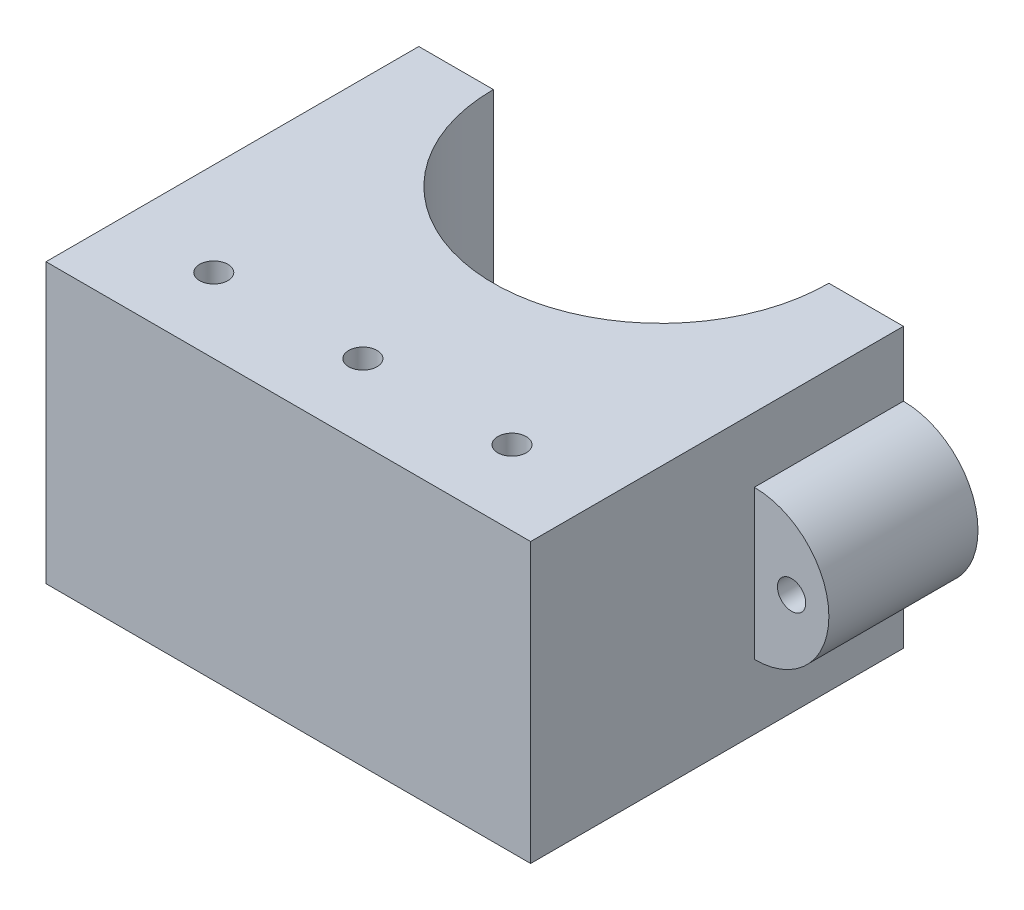
ISO-10303-21;
HEADER;
FILE_DESCRIPTION(('STEP AP214'),'2;1');
FILE_NAME('part.step','',(''),(''),'','','');
FILE_SCHEMA(('AUTOMOTIVE_DESIGN { 1 0 10303 214 1 1 1 1 }'));
ENDSEC;
DATA;
#1=APPLICATION_CONTEXT('core data for automotive mechanical design processes');
#2=APPLICATION_PROTOCOL_DEFINITION('international standard','automotive_design',2000,#1);
#3=PRODUCT_CONTEXT('',#1,'mechanical');
#4=PRODUCT('Part','Part','',(#3));
#5=PRODUCT_RELATED_PRODUCT_CATEGORY('part','',(#4));
#6=PRODUCT_DEFINITION_FORMATION('','',#4);
#7=PRODUCT_DEFINITION_CONTEXT('part definition',#1,'design');
#8=PRODUCT_DEFINITION('design','',#6,#7);
#9=PRODUCT_DEFINITION_SHAPE('','',#8);
#10=(LENGTH_UNIT() NAMED_UNIT(*) SI_UNIT(.MILLI.,.METRE.));
#11=(NAMED_UNIT(*) PLANE_ANGLE_UNIT() SI_UNIT($,.RADIAN.));
#12=(NAMED_UNIT(*) SI_UNIT($,.STERADIAN.) SOLID_ANGLE_UNIT());
#13=UNCERTAINTY_MEASURE_WITH_UNIT(LENGTH_MEASURE(1.E-05),#10,'distance_accuracy_value','');
#14=(GEOMETRIC_REPRESENTATION_CONTEXT(3) GLOBAL_UNCERTAINTY_ASSIGNED_CONTEXT((#13)) GLOBAL_UNIT_ASSIGNED_CONTEXT((#10,
#11,#12)) REPRESENTATION_CONTEXT('',''));
#15=CARTESIAN_POINT('',(0.,0.,0.));
#16=DIRECTION('',(0.,0.,1.));
#17=DIRECTION('',(1.,0.,0.));
#18=AXIS2_PLACEMENT_3D('',#15,#16,#17);
#19=CARTESIAN_POINT('',(0.,47.498,-63.5));
#20=DIRECTION('',(0.,0.,-1.));
#21=DIRECTION('',(-1.,0.,0.));
#22=AXIS2_PLACEMENT_3D('',#19,#20,#21);
#23=PLANE('',#22);
#24=CARTESIAN_POINT('',(-6.29674967595406,24.1394512872404,-63.5));
#25=DIRECTION('',(0.,0.,-1.));
#26=DIRECTION('',(-1.,0.,0.));
#27=AXIS2_PLACEMENT_3D('',#24,#25,#26);
#28=CIRCLE('',#27,2.413);
#29=CARTESIAN_POINT('',(-8.70974967595406,24.1394512872404,-63.5));
#30=VERTEX_POINT('',#29);
#31=EDGE_CURVE('E251',#30,#30,#28,.T.);
#32=ORIENTED_EDGE('',*,*,#31,.F.);
#33=EDGE_LOOP('',(#32));
#34=FACE_BOUND('',#33,.T.);
#35=DIRECTION('',(0.,-1.,0.));
#36=VECTOR('',#35,1.);
#37=CARTESIAN_POINT('',(0.,47.498,-63.5));
#38=LINE('',#37,#36);
#39=CARTESIAN_POINT('',(0.,11.5906254644257,-63.5));
#40=VERTEX_POINT('',#39);
#41=CARTESIAN_POINT('',(0.,0.,-63.5));
#42=VERTEX_POINT('',#41);
#43=EDGE_CURVE('E105',#40,#42,#38,.T.);
#44=ORIENTED_EDGE('',*,*,#43,.F.);
#45=CARTESIAN_POINT('',(0.,24.2906254644257,-63.5));
#46=DIRECTION('',(0.,0.,-1.));
#47=DIRECTION('',(-1.,0.,0.));
#48=AXIS2_PLACEMENT_3D('',#45,#46,#47);
#49=CIRCLE('',#48,12.7);
#50=CARTESIAN_POINT('',(0.,36.9906254644257,-63.5));
#51=VERTEX_POINT('',#50);
#52=EDGE_CURVE('E107',#40,#51,#49,.T.);
#53=ORIENTED_EDGE('',*,*,#52,.T.);
#54=CARTESIAN_POINT('',(0.,47.498,-63.5));
#55=VERTEX_POINT('',#54);
#56=EDGE_CURVE('E112',#55,#51,#38,.T.);
#57=ORIENTED_EDGE('',*,*,#56,.F.);
#58=DIRECTION('',(1.,0.,0.));
#59=VECTOR('',#58,1.);
#60=CARTESIAN_POINT('',(0.,47.498,-63.5));
#61=LINE('',#60,#59);
#62=CARTESIAN_POINT('',(12.7,47.498,-63.5));
#63=VERTEX_POINT('',#62);
#64=EDGE_CURVE('E157',#55,#63,#61,.T.);
#65=ORIENTED_EDGE('',*,*,#64,.T.);
#66=DIRECTION('',(0.,-1.,0.));
#67=VECTOR('',#66,1.);
#68=CARTESIAN_POINT('',(12.7,47.498,-63.5));
#69=LINE('',#68,#67);
#70=CARTESIAN_POINT('',(12.7,0.,-63.5));
#71=VERTEX_POINT('',#70);
#72=EDGE_CURVE('E176',#63,#71,#69,.T.);
#73=ORIENTED_EDGE('',*,*,#72,.T.);
#74=DIRECTION('',(1.,0.,0.));
#75=VECTOR('',#74,1.);
#76=CARTESIAN_POINT('',(0.,0.,-63.5));
#77=LINE('',#76,#75);
#78=EDGE_CURVE('E109',#42,#71,#77,.T.);
#79=ORIENTED_EDGE('',*,*,#78,.F.);
#80=EDGE_LOOP('',(#44,#53,#57,#65,#73,#79));
#81=FACE_BOUND('',#80,.T.);
#82=ADVANCED_FACE('F32',(#34,#81),#23,.T.);
#83=CARTESIAN_POINT('',(0.,47.498,0.));
#84=DIRECTION('',(-1.,0.,0.));
#85=DIRECTION('',(0.,0.,1.));
#86=AXIS2_PLACEMENT_3D('',#83,#84,#85);
#87=PLANE('',#86);
#88=DIRECTION('',(0.,0.,-1.));
#89=VECTOR('',#88,1.);
#90=CARTESIAN_POINT('',(0.,36.9906254644257,-38.1));
#91=LINE('',#90,#89);
#92=CARTESIAN_POINT('',(0.,36.9906254644257,-38.1));
#93=VERTEX_POINT('',#92);
#94=EDGE_CURVE('E11',#93,#51,#91,.T.);
#95=ORIENTED_EDGE('',*,*,#94,.F.);
#96=DIRECTION('',(0.,-1.,0.));
#97=VECTOR('',#96,1.);
#98=CARTESIAN_POINT('',(0.,47.498,-38.1));
#99=LINE('',#98,#97);
#100=CARTESIAN_POINT('',(0.,11.5906254644257,-38.1));
#101=VERTEX_POINT('',#100);
#102=EDGE_CURVE('E46',#93,#101,#99,.T.);
#103=ORIENTED_EDGE('',*,*,#102,.T.);
#104=DIRECTION('',(0.,0.,-1.));
#105=VECTOR('',#104,1.);
#106=CARTESIAN_POINT('',(0.,11.5906254644257,-38.1));
#107=LINE('',#106,#105);
#108=EDGE_CURVE('E39',#40,#101,#107,.F.);
#109=ORIENTED_EDGE('',*,*,#108,.F.);
#110=ORIENTED_EDGE('',*,*,#43,.T.);
#111=DIRECTION('',(0.,0.,-1.));
#112=VECTOR('',#111,1.);
#113=CARTESIAN_POINT('',(0.,0.,0.));
#114=LINE('',#113,#112);
#115=CARTESIAN_POINT('',(0.,0.,0.));
#116=VERTEX_POINT('',#115);
#117=EDGE_CURVE('E161',#116,#42,#114,.T.);
#118=ORIENTED_EDGE('',*,*,#117,.F.);
#119=DIRECTION('',(0.,-1.,0.));
#120=VECTOR('',#119,1.);
#121=CARTESIAN_POINT('',(0.,47.498,0.));
#122=LINE('',#121,#120);
#123=CARTESIAN_POINT('',(0.,47.498,0.));
#124=VERTEX_POINT('',#123);
#125=EDGE_CURVE('E113',#124,#116,#122,.T.);
#126=ORIENTED_EDGE('',*,*,#125,.F.);
#127=DIRECTION('',(0.,0.,-1.));
#128=VECTOR('',#127,1.);
#129=CARTESIAN_POINT('',(0.,47.498,0.));
#130=LINE('',#129,#128);
#131=EDGE_CURVE('E173',#124,#55,#130,.T.);
#132=ORIENTED_EDGE('',*,*,#131,.T.);
#133=ORIENTED_EDGE('',*,*,#56,.T.);
#134=EDGE_LOOP('',(#95,#103,#109,#110,#118,#126,#132,#133));
#135=FACE_BOUND('',#134,.T.);
#136=ADVANCED_FACE('F115',(#135),#87,.T.);
#137=CARTESIAN_POINT('',(82.55,47.498,0.));
#138=DIRECTION('',(0.,0.,1.));
#139=DIRECTION('',(1.,0.,0.));
#140=AXIS2_PLACEMENT_3D('',#137,#138,#139);
#141=PLANE('',#140);
#142=DIRECTION('',(-1.,0.,0.));
#143=VECTOR('',#142,1.);
#144=CARTESIAN_POINT('',(82.55,0.,0.));
#145=LINE('',#144,#143);
#146=CARTESIAN_POINT('',(82.55,0.,0.));
#147=VERTEX_POINT('',#146);
#148=EDGE_CURVE('E187',#147,#116,#145,.T.);
#149=ORIENTED_EDGE('',*,*,#148,.F.);
#150=DIRECTION('',(0.,-1.,0.));
#151=VECTOR('',#150,1.);
#152=CARTESIAN_POINT('',(82.55,47.498,0.));
#153=LINE('',#152,#151);
#154=CARTESIAN_POINT('',(82.55,47.498,0.));
#155=VERTEX_POINT('',#154);
#156=EDGE_CURVE('E193',#155,#147,#153,.T.);
#157=ORIENTED_EDGE('',*,*,#156,.F.);
#158=DIRECTION('',(-1.,0.,0.));
#159=VECTOR('',#158,1.);
#160=CARTESIAN_POINT('',(82.55,47.498,0.));
#161=LINE('',#160,#159);
#162=EDGE_CURVE('E170',#155,#124,#161,.T.);
#163=ORIENTED_EDGE('',*,*,#162,.T.);
#164=ORIENTED_EDGE('',*,*,#125,.T.);
#165=EDGE_LOOP('',(#149,#157,#163,#164));
#166=FACE_BOUND('',#165,.T.);
#167=ADVANCED_FACE('F228',(#166),#141,.T.);
#168=CARTESIAN_POINT('',(82.55,47.498,-63.5));
#169=DIRECTION('',(1.,0.,0.));
#170=DIRECTION('',(0.,0.,-1.));
#171=AXIS2_PLACEMENT_3D('',#168,#169,#170);
#172=PLANE('',#171);
#173=DIRECTION('',(0.,0.,-1.));
#174=VECTOR('',#173,1.);
#175=CARTESIAN_POINT('',(82.55,11.049,-38.1));
#176=LINE('',#175,#174);
#177=CARTESIAN_POINT('',(82.55,11.049,-38.1));
#178=VERTEX_POINT('',#177);
#179=CARTESIAN_POINT('',(82.55,11.049,-63.5));
#180=VERTEX_POINT('',#179);
#181=EDGE_CURVE('E136',#178,#180,#176,.T.);
#182=ORIENTED_EDGE('',*,*,#181,.F.);
#183=DIRECTION('',(0.,1.,0.));
#184=VECTOR('',#183,1.);
#185=CARTESIAN_POINT('',(82.55,47.498,-38.1));
#186=LINE('',#185,#184);
#187=CARTESIAN_POINT('',(82.55,36.449,-38.1));
#188=VERTEX_POINT('',#187);
#189=EDGE_CURVE('E191',#178,#188,#186,.T.);
#190=ORIENTED_EDGE('',*,*,#189,.T.);
#191=DIRECTION('',(0.,0.,-1.));
#192=VECTOR('',#191,1.);
#193=CARTESIAN_POINT('',(82.55,36.449,-38.1));
#194=LINE('',#193,#192);
#195=CARTESIAN_POINT('',(82.55,36.449,-63.5));
#196=VERTEX_POINT('',#195);
#197=EDGE_CURVE('E133',#196,#188,#194,.F.);
#198=ORIENTED_EDGE('',*,*,#197,.F.);
#199=DIRECTION('',(0.,-1.,0.));
#200=VECTOR('',#199,1.);
#201=CARTESIAN_POINT('',(82.55,47.498,-63.5));
#202=LINE('',#201,#200);
#203=CARTESIAN_POINT('',(82.55,47.498,-63.5));
#204=VERTEX_POINT('',#203);
#205=EDGE_CURVE('E195',#204,#196,#202,.T.);
#206=ORIENTED_EDGE('',*,*,#205,.F.);
#207=DIRECTION('',(0.,0.,1.));
#208=VECTOR('',#207,1.);
#209=CARTESIAN_POINT('',(82.55,47.498,-63.5));
#210=LINE('',#209,#208);
#211=EDGE_CURVE('E167',#204,#155,#210,.T.);
#212=ORIENTED_EDGE('',*,*,#211,.T.);
#213=ORIENTED_EDGE('',*,*,#156,.T.);
#214=DIRECTION('',(0.,0.,1.));
#215=VECTOR('',#214,1.);
#216=CARTESIAN_POINT('',(82.55,0.,-63.5));
#217=LINE('',#216,#215);
#218=CARTESIAN_POINT('',(82.55,0.,-63.5));
#219=VERTEX_POINT('',#218);
#220=EDGE_CURVE('E184',#219,#147,#217,.T.);
#221=ORIENTED_EDGE('',*,*,#220,.F.);
#222=EDGE_CURVE('E198',#180,#219,#202,.T.);
#223=ORIENTED_EDGE('',*,*,#222,.F.);
#224=EDGE_LOOP('',(#182,#190,#198,#206,#212,#213,#221,#223));
#225=FACE_BOUND('',#224,.T.);
#226=ADVANCED_FACE('F207',(#225),#172,.T.);
#227=CARTESIAN_POINT('',(69.85,47.498,-63.5));
#228=DIRECTION('',(0.,0.,-1.));
#229=DIRECTION('',(-1.,0.,0.));
#230=AXIS2_PLACEMENT_3D('',#227,#228,#229);
#231=PLANE('',#230);
#232=CARTESIAN_POINT('',(88.9,23.749,-63.5));
#233=DIRECTION('',(0.,0.,-1.));
#234=DIRECTION('',(-1.,0.,0.));
#235=AXIS2_PLACEMENT_3D('',#232,#233,#234);
#236=CIRCLE('',#235,2.413);
#237=CARTESIAN_POINT('',(86.487,23.749,-63.5));
#238=VERTEX_POINT('',#237);
#239=EDGE_CURVE('E126',#238,#238,#236,.T.);
#240=ORIENTED_EDGE('',*,*,#239,.F.);
#241=EDGE_LOOP('',(#240));
#242=FACE_BOUND('',#241,.T.);
#243=DIRECTION('',(1.,0.,0.));
#244=VECTOR('',#243,1.);
#245=CARTESIAN_POINT('',(69.85,0.,-63.5));
#246=LINE('',#245,#244);
#247=CARTESIAN_POINT('',(69.85,0.,-63.5));
#248=VERTEX_POINT('',#247);
#249=EDGE_CURVE('E181',#248,#219,#246,.T.);
#250=ORIENTED_EDGE('',*,*,#249,.F.);
#251=DIRECTION('',(0.,-1.,0.));
#252=VECTOR('',#251,1.);
#253=CARTESIAN_POINT('',(69.85,47.498,-63.5));
#254=LINE('',#253,#252);
#255=CARTESIAN_POINT('',(69.85,47.498,-63.5));
#256=VERTEX_POINT('',#255);
#257=EDGE_CURVE('E199',#256,#248,#254,.T.);
#258=ORIENTED_EDGE('',*,*,#257,.F.);
#259=DIRECTION('',(1.,0.,0.));
#260=VECTOR('',#259,1.);
#261=CARTESIAN_POINT('',(69.85,47.498,-63.5));
#262=LINE('',#261,#260);
#263=EDGE_CURVE('E164',#256,#204,#262,.T.);
#264=ORIENTED_EDGE('',*,*,#263,.T.);
#265=ORIENTED_EDGE('',*,*,#205,.T.);
#266=CARTESIAN_POINT('',(82.55,23.749,-63.5));
#267=DIRECTION('',(0.,0.,-1.));
#268=DIRECTION('',(-1.,0.,0.));
#269=AXIS2_PLACEMENT_3D('',#266,#267,#268);
#270=CIRCLE('',#269,12.7);
#271=EDGE_CURVE('E123',#196,#180,#270,.T.);
#272=ORIENTED_EDGE('',*,*,#271,.T.);
#273=ORIENTED_EDGE('',*,*,#222,.T.);
#274=EDGE_LOOP('',(#250,#258,#264,#265,#272,#273));
#275=FACE_BOUND('',#274,.T.);
#276=ADVANCED_FACE('F216',(#242,#275),#231,.T.);
#277=CARTESIAN_POINT('',(41.275,47.498,-63.5));
#278=DIRECTION('',(0.,-1.,0.));
#279=DIRECTION('',(0.,0.,-1.));
#280=AXIS2_PLACEMENT_3D('',#277,#278,#279);
#281=CYLINDRICAL_SURFACE('',#280,28.575);
#282=CARTESIAN_POINT('',(41.275,0.,-63.5));
#283=DIRECTION('',(0.,1.,0.));
#284=DIRECTION('',(0.,0.,1.));
#285=AXIS2_PLACEMENT_3D('',#282,#283,#284);
#286=CIRCLE('',#285,28.575);
#287=EDGE_CURVE('E178',#71,#248,#286,.T.);
#288=ORIENTED_EDGE('',*,*,#287,.F.);
#289=ORIENTED_EDGE('',*,*,#72,.F.);
#290=CARTESIAN_POINT('',(41.275,47.498,-63.5));
#291=DIRECTION('',(0.,1.,0.));
#292=DIRECTION('',(0.,0.,1.));
#293=AXIS2_PLACEMENT_3D('',#290,#291,#292);
#294=CIRCLE('',#293,28.575);
#295=EDGE_CURVE('E160',#63,#256,#294,.T.);
#296=ORIENTED_EDGE('',*,*,#295,.T.);
#297=ORIENTED_EDGE('',*,*,#257,.T.);
#298=EDGE_LOOP('',(#288,#289,#296,#297));
#299=FACE_BOUND('',#298,.T.);
#300=ADVANCED_FACE('F233',(#299),#281,.F.);
#301=CARTESIAN_POINT('',(41.275,47.498,-63.5));
#302=DIRECTION('',(0.,1.,0.));
#303=DIRECTION('',(0.,0.,1.));
#304=AXIS2_PLACEMENT_3D('',#301,#302,#303);
#305=PLANE('',#304);
#306=CARTESIAN_POINT('',(41.275,47.498,-12.7));
#307=DIRECTION('',(0.,1.,0.));
#308=DIRECTION('',(0.,0.,1.));
#309=AXIS2_PLACEMENT_3D('',#306,#307,#308);
#310=CIRCLE('',#309,2.413);
#311=CARTESIAN_POINT('',(41.275,47.498,-10.287));
#312=VERTEX_POINT('',#311);
#313=EDGE_CURVE('E144',#312,#312,#310,.T.);
#314=ORIENTED_EDGE('',*,*,#313,.F.);
#315=EDGE_LOOP('',(#314));
#316=FACE_BOUND('',#315,.T.);
#317=CARTESIAN_POINT('',(66.675,47.498,-12.7));
#318=DIRECTION('',(0.,1.,0.));
#319=DIRECTION('',(0.,0.,1.));
#320=AXIS2_PLACEMENT_3D('',#317,#318,#319);
#321=CIRCLE('',#320,2.41299999999999);
#322=CARTESIAN_POINT('',(66.675,47.498,-10.287));
#323=VERTEX_POINT('',#322);
#324=EDGE_CURVE('E139',#323,#323,#321,.T.);
#325=ORIENTED_EDGE('',*,*,#324,.F.);
#326=EDGE_LOOP('',(#325));
#327=FACE_BOUND('',#326,.T.);
#328=CARTESIAN_POINT('',(15.875,47.498,-12.7));
#329=DIRECTION('',(0.,1.,0.));
#330=DIRECTION('',(0.,0.,1.));
#331=AXIS2_PLACEMENT_3D('',#328,#329,#330);
#332=CIRCLE('',#331,2.413);
#333=CARTESIAN_POINT('',(15.875,47.498,-15.113));
#334=VERTEX_POINT('',#333);
#335=EDGE_CURVE('E154',#334,#334,#332,.F.);
#336=ORIENTED_EDGE('',*,*,#335,.T.);
#337=EDGE_LOOP('',(#336));
#338=FACE_BOUND('',#337,.T.);
#339=ORIENTED_EDGE('',*,*,#64,.F.);
#340=ORIENTED_EDGE('',*,*,#131,.F.);
#341=ORIENTED_EDGE('',*,*,#162,.F.);
#342=ORIENTED_EDGE('',*,*,#211,.F.);
#343=ORIENTED_EDGE('',*,*,#263,.F.);
#344=ORIENTED_EDGE('',*,*,#295,.F.);
#345=EDGE_LOOP('',(#339,#340,#341,#342,#343,#344));
#346=FACE_BOUND('',#345,.T.);
#347=ADVANCED_FACE('F223',(#316,#327,#338,#346),#305,.T.);
#348=CARTESIAN_POINT('',(41.275,0.,-63.5));
#349=DIRECTION('',(0.,1.,0.));
#350=DIRECTION('',(0.,0.,1.));
#351=AXIS2_PLACEMENT_3D('',#348,#349,#350);
#352=PLANE('',#351);
#353=CARTESIAN_POINT('',(41.275,0.,-12.7));
#354=DIRECTION('',(0.,1.,0.));
#355=DIRECTION('',(0.,0.,1.));
#356=AXIS2_PLACEMENT_3D('',#353,#354,#355);
#357=CIRCLE('',#356,2.413);
#358=CARTESIAN_POINT('',(41.275,0.,-10.287));
#359=VERTEX_POINT('',#358);
#360=EDGE_CURVE('E140',#359,#359,#357,.T.);
#361=ORIENTED_EDGE('',*,*,#360,.T.);
#362=EDGE_LOOP('',(#361));
#363=FACE_BOUND('',#362,.T.);
#364=CARTESIAN_POINT('',(66.675,0.,-12.7));
#365=DIRECTION('',(0.,1.,0.));
#366=DIRECTION('',(0.,0.,1.));
#367=AXIS2_PLACEMENT_3D('',#364,#365,#366);
#368=CIRCLE('',#367,2.41299999999999);
#369=CARTESIAN_POINT('',(66.675,0.,-10.287));
#370=VERTEX_POINT('',#369);
#371=EDGE_CURVE('E147',#370,#370,#368,.T.);
#372=ORIENTED_EDGE('',*,*,#371,.T.);
#373=EDGE_LOOP('',(#372));
#374=FACE_BOUND('',#373,.T.);
#375=CARTESIAN_POINT('',(15.875,0.,-12.7));
#376=DIRECTION('',(0.,1.,0.));
#377=DIRECTION('',(0.,0.,1.));
#378=AXIS2_PLACEMENT_3D('',#375,#376,#377);
#379=CIRCLE('',#378,2.413);
#380=CARTESIAN_POINT('',(15.875,0.,-15.113));
#381=VERTEX_POINT('',#380);
#382=EDGE_CURVE('E143',#381,#381,#379,.T.);
#383=ORIENTED_EDGE('',*,*,#382,.T.);
#384=EDGE_LOOP('',(#383));
#385=FACE_BOUND('',#384,.T.);
#386=ORIENTED_EDGE('',*,*,#78,.T.);
#387=ORIENTED_EDGE('',*,*,#287,.T.);
#388=ORIENTED_EDGE('',*,*,#249,.T.);
#389=ORIENTED_EDGE('',*,*,#220,.T.);
#390=ORIENTED_EDGE('',*,*,#148,.T.);
#391=ORIENTED_EDGE('',*,*,#117,.T.);
#392=EDGE_LOOP('',(#386,#387,#388,#389,#390,#391));
#393=FACE_BOUND('',#392,.T.);
#394=ADVANCED_FACE('F230',(#363,#374,#385,#393),#352,.F.);
#395=CARTESIAN_POINT('',(15.875,47.498012,-12.7));
#396=DIRECTION('',(0.,-1.,0.));
#397=DIRECTION('',(0.,0.,-1.));
#398=AXIS2_PLACEMENT_3D('',#395,#396,#397);
#399=CYLINDRICAL_SURFACE('',#398,2.413);
#400=CARTESIAN_POINT('',(15.875,47.498,-15.113));
#401=CARTESIAN_POINT('',(15.875,47.0032291666667,-15.113));
#402=CARTESIAN_POINT('',(15.875,46.5084583333333,-15.113));
#403=CARTESIAN_POINT('',(15.875,45.5189166666667,-15.113));
#404=CARTESIAN_POINT('',(15.875,45.0241458333333,-15.113));
#405=CARTESIAN_POINT('',(15.875,44.0346041666667,-15.113));
#406=CARTESIAN_POINT('',(15.875,43.5398333333333,-15.113));
#407=CARTESIAN_POINT('',(15.875,42.5502916666667,-15.113));
#408=CARTESIAN_POINT('',(15.875,42.0555208333333,-15.113));
#409=CARTESIAN_POINT('',(15.875,41.0659791666667,-15.113));
#410=CARTESIAN_POINT('',(15.875,40.5712083333333,-15.113));
#411=CARTESIAN_POINT('',(15.875,39.5816666666667,-15.113));
#412=CARTESIAN_POINT('',(15.875,39.0868958333333,-15.113));
#413=CARTESIAN_POINT('',(15.875,38.0973541666667,-15.113));
#414=CARTESIAN_POINT('',(15.875,37.6025833333333,-15.113));
#415=CARTESIAN_POINT('',(15.875,36.6130416666667,-15.113));
#416=CARTESIAN_POINT('',(15.875,36.1182708333333,-15.113));
#417=CARTESIAN_POINT('',(15.875,35.1287291666667,-15.113));
#418=CARTESIAN_POINT('',(15.875,34.6339583333333,-15.113));
#419=CARTESIAN_POINT('',(15.875,33.6444166666667,-15.113));
#420=CARTESIAN_POINT('',(15.875,33.1496458333333,-15.113));
#421=CARTESIAN_POINT('',(15.875,32.1601041666667,-15.113));
#422=CARTESIAN_POINT('',(15.875,31.6653333333333,-15.113));
#423=CARTESIAN_POINT('',(15.875,30.6757916666667,-15.113));
#424=CARTESIAN_POINT('',(15.875,30.1810208333333,-15.113));
#425=CARTESIAN_POINT('',(15.875,29.1914791666667,-15.113));
#426=CARTESIAN_POINT('',(15.875,28.6967083333333,-15.113));
#427=CARTESIAN_POINT('',(15.875,27.7071666666667,-15.113));
#428=CARTESIAN_POINT('',(15.875,27.2123958333333,-15.113));
#429=CARTESIAN_POINT('',(15.875,26.2228541666667,-15.113));
#430=CARTESIAN_POINT('',(15.875,25.7280833333333,-15.113));
#431=CARTESIAN_POINT('',(15.875,24.7385416666667,-15.113));
#432=CARTESIAN_POINT('',(15.875,24.2437708333333,-15.113));
#433=CARTESIAN_POINT('',(15.875,23.2542291666667,-15.113));
#434=CARTESIAN_POINT('',(15.875,22.7594583333333,-15.113));
#435=CARTESIAN_POINT('',(15.875,21.7699166666667,-15.113));
#436=CARTESIAN_POINT('',(15.875,21.2751458333333,-15.113));
#437=CARTESIAN_POINT('',(15.875,20.2856041666667,-15.113));
#438=CARTESIAN_POINT('',(15.875,19.7908333333333,-15.113));
#439=CARTESIAN_POINT('',(15.875,18.8012916666667,-15.113));
#440=CARTESIAN_POINT('',(15.875,18.3065208333333,-15.113));
#441=CARTESIAN_POINT('',(15.875,17.3169791666667,-15.113));
#442=CARTESIAN_POINT('',(15.875,16.8222083333333,-15.113));
#443=CARTESIAN_POINT('',(15.875,15.8326666666667,-15.113));
#444=CARTESIAN_POINT('',(15.875,15.3378958333333,-15.113));
#445=CARTESIAN_POINT('',(15.875,14.3483541666667,-15.113));
#446=CARTESIAN_POINT('',(15.875,13.8535833333333,-15.113));
#447=CARTESIAN_POINT('',(15.875,12.8640416666667,-15.113));
#448=CARTESIAN_POINT('',(15.875,12.3692708333333,-15.113));
#449=CARTESIAN_POINT('',(15.875,11.3797291666667,-15.113));
#450=CARTESIAN_POINT('',(15.875,10.8849583333333,-15.113));
#451=CARTESIAN_POINT('',(15.875,9.89541666666667,-15.113));
#452=CARTESIAN_POINT('',(15.875,9.40064583333333,-15.113));
#453=CARTESIAN_POINT('',(15.875,8.41110416666667,-15.113));
#454=CARTESIAN_POINT('',(15.875,7.91633333333333,-15.113));
#455=CARTESIAN_POINT('',(15.875,6.92679166666667,-15.113));
#456=CARTESIAN_POINT('',(15.875,6.43202083333333,-15.113));
#457=CARTESIAN_POINT('',(15.875,5.44247916666666,-15.113));
#458=CARTESIAN_POINT('',(15.875,4.94770833333333,-15.113));
#459=CARTESIAN_POINT('',(15.875,3.95816666666667,-15.113));
#460=CARTESIAN_POINT('',(15.875,3.46339583333333,-15.113));
#461=CARTESIAN_POINT('',(15.875,2.47385416666667,-15.113));
#462=CARTESIAN_POINT('',(15.875,1.97908333333333,-15.113));
#463=CARTESIAN_POINT('',(15.875,0.989541666666668,-15.113));
#464=CARTESIAN_POINT('',(15.875,0.494770833333334,-15.113));
#465=CARTESIAN_POINT('',(15.875,0.,-15.113));
#466=B_SPLINE_CURVE_WITH_KNOTS('',3,(#400,#401,#402,#403,#404,#405,#406,#407,#408,#409,#410,
#411,#412,#413,#414,#415,#416,#417,#418,#419,#420,#421,#422,#423,#424,#425,#426,#427,#428,#429,
#430,#431,#432,#433,#434,#435,#436,#437,#438,#439,#440,#441,#442,#443,#444,#445,#446,#447,#448,
#449,#450,#451,#452,#453,#454,#455,#456,#457,#458,#459,#460,#461,#462,#463,#464,#465),
.UNSPECIFIED.,.F.,.F.,(4,2,2,2,2,2,2,2,2,2,2,2,2,2,2,2,2,2,2,2,2,2,2,2,2,2,2,2,2,2,2,2,4),(0.,
1.48431249999999,2.968625,4.4529375,5.93725,7.42156249999999,8.90587499999999,10.3901875,
11.8745,13.3588125,14.843125,16.3274375,17.81175,19.2960625,20.780375,22.2646875,23.749,
25.2333125,26.717625,28.2019375,29.68625,31.1705625,32.654875,34.1391875,35.6235,37.1078125,
38.592125,40.0764375,41.56075,43.0450625,44.529375,46.0136875,47.498),.UNSPECIFIED.);
#467=EDGE_CURVE('BSEAM290',#334,#381,#466,.T.);
#468=ORIENTED_EDGE('',*,*,#335,.F.);
#469=ORIENTED_EDGE('',*,*,#382,.F.);
#470=ORIENTED_EDGE('',*,*,#467,.T.);
#471=ORIENTED_EDGE('',*,*,#467,.F.);
#472=EDGE_LOOP('',(#468,#470,#469,#471));
#473=FACE_BOUND('',#472,.T.);
#474=ADVANCED_FACE('F290',(#473),#399,.F.);
#475=CARTESIAN_POINT('',(66.675,0.,-12.7));
#476=DIRECTION('',(0.,1.,0.));
#477=DIRECTION('',(0.,0.,1.));
#478=AXIS2_PLACEMENT_3D('',#475,#476,#477);
#479=CYLINDRICAL_SURFACE('',#478,2.41299999999999);
#480=CARTESIAN_POINT('',(66.675,0.,-10.287));
#481=CARTESIAN_POINT('',(66.675,0.494770833333333,-10.287));
#482=CARTESIAN_POINT('',(66.675,0.989541666666666,-10.287));
#483=CARTESIAN_POINT('',(66.675,1.97908333333333,-10.287));
#484=CARTESIAN_POINT('',(66.675,2.47385416666667,-10.287));
#485=CARTESIAN_POINT('',(66.675,3.46339583333333,-10.287));
#486=CARTESIAN_POINT('',(66.675,3.95816666666667,-10.287));
#487=CARTESIAN_POINT('',(66.675,4.94770833333333,-10.287));
#488=CARTESIAN_POINT('',(66.675,5.44247916666667,-10.287));
#489=CARTESIAN_POINT('',(66.675,6.43202083333333,-10.287));
#490=CARTESIAN_POINT('',(66.675,6.92679166666667,-10.287));
#491=CARTESIAN_POINT('',(66.675,7.91633333333333,-10.287));
#492=CARTESIAN_POINT('',(66.675,8.41110416666667,-10.287));
#493=CARTESIAN_POINT('',(66.675,9.40064583333333,-10.287));
#494=CARTESIAN_POINT('',(66.675,9.89541666666667,-10.287));
#495=CARTESIAN_POINT('',(66.675,10.8849583333333,-10.287));
#496=CARTESIAN_POINT('',(66.675,11.3797291666667,-10.287));
#497=CARTESIAN_POINT('',(66.675,12.3692708333333,-10.287));
#498=CARTESIAN_POINT('',(66.675,12.8640416666667,-10.287));
#499=CARTESIAN_POINT('',(66.675,13.8535833333333,-10.287));
#500=CARTESIAN_POINT('',(66.675,14.3483541666667,-10.287));
#501=CARTESIAN_POINT('',(66.675,15.3378958333333,-10.287));
#502=CARTESIAN_POINT('',(66.675,15.8326666666667,-10.287));
#503=CARTESIAN_POINT('',(66.675,16.8222083333333,-10.287));
#504=CARTESIAN_POINT('',(66.675,17.3169791666667,-10.287));
#505=CARTESIAN_POINT('',(66.675,18.3065208333333,-10.287));
#506=CARTESIAN_POINT('',(66.675,18.8012916666667,-10.287));
#507=CARTESIAN_POINT('',(66.675,19.7908333333333,-10.287));
#508=CARTESIAN_POINT('',(66.675,20.2856041666667,-10.287));
#509=CARTESIAN_POINT('',(66.675,21.2751458333333,-10.287));
#510=CARTESIAN_POINT('',(66.675,21.7699166666667,-10.287));
#511=CARTESIAN_POINT('',(66.675,22.7594583333333,-10.287));
#512=CARTESIAN_POINT('',(66.675,23.2542291666667,-10.287));
#513=CARTESIAN_POINT('',(66.675,24.2437708333333,-10.287));
#514=CARTESIAN_POINT('',(66.675,24.7385416666667,-10.287));
#515=CARTESIAN_POINT('',(66.675,25.7280833333333,-10.287));
#516=CARTESIAN_POINT('',(66.675,26.2228541666667,-10.287));
#517=CARTESIAN_POINT('',(66.675,27.2123958333333,-10.287));
#518=CARTESIAN_POINT('',(66.675,27.7071666666667,-10.287));
#519=CARTESIAN_POINT('',(66.675,28.6967083333333,-10.287));
#520=CARTESIAN_POINT('',(66.675,29.1914791666667,-10.287));
#521=CARTESIAN_POINT('',(66.675,30.1810208333333,-10.287));
#522=CARTESIAN_POINT('',(66.675,30.6757916666667,-10.287));
#523=CARTESIAN_POINT('',(66.675,31.6653333333333,-10.287));
#524=CARTESIAN_POINT('',(66.675,32.1601041666667,-10.287));
#525=CARTESIAN_POINT('',(66.675,33.1496458333333,-10.287));
#526=CARTESIAN_POINT('',(66.675,33.6444166666667,-10.287));
#527=CARTESIAN_POINT('',(66.675,34.6339583333333,-10.287));
#528=CARTESIAN_POINT('',(66.675,35.1287291666667,-10.287));
#529=CARTESIAN_POINT('',(66.675,36.1182708333333,-10.287));
#530=CARTESIAN_POINT('',(66.675,36.6130416666667,-10.287));
#531=CARTESIAN_POINT('',(66.675,37.6025833333333,-10.287));
#532=CARTESIAN_POINT('',(66.675,38.0973541666667,-10.287));
#533=CARTESIAN_POINT('',(66.675,39.0868958333333,-10.287));
#534=CARTESIAN_POINT('',(66.675,39.5816666666667,-10.287));
#535=CARTESIAN_POINT('',(66.675,40.5712083333333,-10.287));
#536=CARTESIAN_POINT('',(66.675,41.0659791666667,-10.287));
#537=CARTESIAN_POINT('',(66.675,42.0555208333333,-10.287));
#538=CARTESIAN_POINT('',(66.675,42.5502916666667,-10.287));
#539=CARTESIAN_POINT('',(66.675,43.5398333333333,-10.287));
#540=CARTESIAN_POINT('',(66.675,44.0346041666667,-10.287));
#541=CARTESIAN_POINT('',(66.675,45.0241458333333,-10.287));
#542=CARTESIAN_POINT('',(66.675,45.5189166666667,-10.287));
#543=CARTESIAN_POINT('',(66.675,46.5084583333333,-10.287));
#544=CARTESIAN_POINT('',(66.675,47.0032291666667,-10.287));
#545=CARTESIAN_POINT('',(66.675,47.498,-10.287));
#546=B_SPLINE_CURVE_WITH_KNOTS('',3,(#480,#481,#482,#483,#484,#485,#486,#487,#488,#489,#490,
#491,#492,#493,#494,#495,#496,#497,#498,#499,#500,#501,#502,#503,#504,#505,#506,#507,#508,#509,
#510,#511,#512,#513,#514,#515,#516,#517,#518,#519,#520,#521,#522,#523,#524,#525,#526,#527,#528,
#529,#530,#531,#532,#533,#534,#535,#536,#537,#538,#539,#540,#541,#542,#543,#544,#545),
.UNSPECIFIED.,.F.,.F.,(4,2,2,2,2,2,2,2,2,2,2,2,2,2,2,2,2,2,2,2,2,2,2,2,2,2,2,2,2,2,2,2,4),(0.,
1.4843125,2.968625,4.4529375,5.93725,7.4215625,8.905875,10.3901875,11.8745,13.3588125,14.843125,
16.3274375,17.81175,19.2960625,20.780375,22.2646875,23.749,25.2333125,26.717625,28.2019375,
29.68625,31.1705625,32.654875,34.1391875,35.6235,37.1078125,38.592125,40.0764375,41.56075,
43.0450625,44.529375,46.0136875,47.498),.UNSPECIFIED.);
#547=EDGE_CURVE('BSEAM286',#370,#323,#546,.T.);
#548=ORIENTED_EDGE('',*,*,#371,.F.);
#549=ORIENTED_EDGE('',*,*,#324,.T.);
#550=ORIENTED_EDGE('',*,*,#547,.T.);
#551=ORIENTED_EDGE('',*,*,#547,.F.);
#552=EDGE_LOOP('',(#548,#550,#549,#551));
#553=FACE_BOUND('',#552,.T.);
#554=ADVANCED_FACE('F286',(#553),#479,.F.);
#555=CARTESIAN_POINT('',(41.275,0.,-12.7));
#556=DIRECTION('',(0.,1.,0.));
#557=DIRECTION('',(0.,0.,1.));
#558=AXIS2_PLACEMENT_3D('',#555,#556,#557);
#559=CYLINDRICAL_SURFACE('',#558,2.413);
#560=CARTESIAN_POINT('',(41.275,0.,-10.287));
#561=CARTESIAN_POINT('',(41.275,0.494770833333333,-10.287));
#562=CARTESIAN_POINT('',(41.275,0.989541666666666,-10.287));
#563=CARTESIAN_POINT('',(41.275,1.97908333333333,-10.287));
#564=CARTESIAN_POINT('',(41.275,2.47385416666667,-10.287));
#565=CARTESIAN_POINT('',(41.275,3.46339583333333,-10.287));
#566=CARTESIAN_POINT('',(41.275,3.95816666666667,-10.287));
#567=CARTESIAN_POINT('',(41.275,4.94770833333333,-10.287));
#568=CARTESIAN_POINT('',(41.275,5.44247916666667,-10.287));
#569=CARTESIAN_POINT('',(41.275,6.43202083333333,-10.287));
#570=CARTESIAN_POINT('',(41.275,6.92679166666667,-10.287));
#571=CARTESIAN_POINT('',(41.275,7.91633333333333,-10.287));
#572=CARTESIAN_POINT('',(41.275,8.41110416666667,-10.287));
#573=CARTESIAN_POINT('',(41.275,9.40064583333333,-10.287));
#574=CARTESIAN_POINT('',(41.275,9.89541666666667,-10.287));
#575=CARTESIAN_POINT('',(41.275,10.8849583333333,-10.287));
#576=CARTESIAN_POINT('',(41.275,11.3797291666667,-10.287));
#577=CARTESIAN_POINT('',(41.275,12.3692708333333,-10.287));
#578=CARTESIAN_POINT('',(41.275,12.8640416666667,-10.287));
#579=CARTESIAN_POINT('',(41.275,13.8535833333333,-10.287));
#580=CARTESIAN_POINT('',(41.275,14.3483541666667,-10.287));
#581=CARTESIAN_POINT('',(41.275,15.3378958333333,-10.287));
#582=CARTESIAN_POINT('',(41.275,15.8326666666667,-10.287));
#583=CARTESIAN_POINT('',(41.275,16.8222083333333,-10.287));
#584=CARTESIAN_POINT('',(41.275,17.3169791666667,-10.287));
#585=CARTESIAN_POINT('',(41.275,18.3065208333333,-10.287));
#586=CARTESIAN_POINT('',(41.275,18.8012916666667,-10.287));
#587=CARTESIAN_POINT('',(41.275,19.7908333333333,-10.287));
#588=CARTESIAN_POINT('',(41.275,20.2856041666667,-10.287));
#589=CARTESIAN_POINT('',(41.275,21.2751458333333,-10.287));
#590=CARTESIAN_POINT('',(41.275,21.7699166666667,-10.287));
#591=CARTESIAN_POINT('',(41.275,22.7594583333333,-10.287));
#592=CARTESIAN_POINT('',(41.275,23.2542291666667,-10.287));
#593=CARTESIAN_POINT('',(41.275,24.2437708333333,-10.287));
#594=CARTESIAN_POINT('',(41.275,24.7385416666667,-10.287));
#595=CARTESIAN_POINT('',(41.275,25.7280833333333,-10.287));
#596=CARTESIAN_POINT('',(41.275,26.2228541666667,-10.287));
#597=CARTESIAN_POINT('',(41.275,27.2123958333333,-10.287));
#598=CARTESIAN_POINT('',(41.275,27.7071666666667,-10.287));
#599=CARTESIAN_POINT('',(41.275,28.6967083333333,-10.287));
#600=CARTESIAN_POINT('',(41.275,29.1914791666667,-10.287));
#601=CARTESIAN_POINT('',(41.275,30.1810208333333,-10.287));
#602=CARTESIAN_POINT('',(41.275,30.6757916666667,-10.287));
#603=CARTESIAN_POINT('',(41.275,31.6653333333333,-10.287));
#604=CARTESIAN_POINT('',(41.275,32.1601041666667,-10.287));
#605=CARTESIAN_POINT('',(41.275,33.1496458333333,-10.287));
#606=CARTESIAN_POINT('',(41.275,33.6444166666667,-10.287));
#607=CARTESIAN_POINT('',(41.275,34.6339583333333,-10.287));
#608=CARTESIAN_POINT('',(41.275,35.1287291666667,-10.287));
#609=CARTESIAN_POINT('',(41.275,36.1182708333333,-10.287));
#610=CARTESIAN_POINT('',(41.275,36.6130416666667,-10.287));
#611=CARTESIAN_POINT('',(41.275,37.6025833333333,-10.287));
#612=CARTESIAN_POINT('',(41.275,38.0973541666667,-10.287));
#613=CARTESIAN_POINT('',(41.275,39.0868958333333,-10.287));
#614=CARTESIAN_POINT('',(41.275,39.5816666666667,-10.287));
#615=CARTESIAN_POINT('',(41.275,40.5712083333333,-10.287));
#616=CARTESIAN_POINT('',(41.275,41.0659791666667,-10.287));
#617=CARTESIAN_POINT('',(41.275,42.0555208333333,-10.287));
#618=CARTESIAN_POINT('',(41.275,42.5502916666667,-10.287));
#619=CARTESIAN_POINT('',(41.275,43.5398333333333,-10.287));
#620=CARTESIAN_POINT('',(41.275,44.0346041666667,-10.287));
#621=CARTESIAN_POINT('',(41.275,45.0241458333333,-10.287));
#622=CARTESIAN_POINT('',(41.275,45.5189166666667,-10.287));
#623=CARTESIAN_POINT('',(41.275,46.5084583333333,-10.287));
#624=CARTESIAN_POINT('',(41.275,47.0032291666667,-10.287));
#625=CARTESIAN_POINT('',(41.275,47.498,-10.287));
#626=B_SPLINE_CURVE_WITH_KNOTS('',3,(#560,#561,#562,#563,#564,#565,#566,#567,#568,#569,#570,
#571,#572,#573,#574,#575,#576,#577,#578,#579,#580,#581,#582,#583,#584,#585,#586,#587,#588,#589,
#590,#591,#592,#593,#594,#595,#596,#597,#598,#599,#600,#601,#602,#603,#604,#605,#606,#607,#608,
#609,#610,#611,#612,#613,#614,#615,#616,#617,#618,#619,#620,#621,#622,#623,#624,#625),
.UNSPECIFIED.,.F.,.F.,(4,2,2,2,2,2,2,2,2,2,2,2,2,2,2,2,2,2,2,2,2,2,2,2,2,2,2,2,2,2,2,2,4),(0.,
1.4843125,2.968625,4.4529375,5.93725,7.4215625,8.905875,10.3901875,11.8745,13.3588125,14.843125,
16.3274375,17.81175,19.2960625,20.780375,22.2646875,23.749,25.2333125,26.717625,28.2019375,
29.68625,31.1705625,32.654875,34.1391875,35.6235,37.1078125,38.592125,40.0764375,41.56075,
43.0450625,44.529375,46.0136875,47.498),.UNSPECIFIED.);
#627=EDGE_CURVE('BSEAM283',#359,#312,#626,.T.);
#628=ORIENTED_EDGE('',*,*,#360,.F.);
#629=ORIENTED_EDGE('',*,*,#313,.T.);
#630=ORIENTED_EDGE('',*,*,#627,.T.);
#631=ORIENTED_EDGE('',*,*,#627,.F.);
#632=EDGE_LOOP('',(#628,#630,#629,#631));
#633=FACE_BOUND('',#632,.T.);
#634=ADVANCED_FACE('F283',(#633),#559,.F.);
#635=CARTESIAN_POINT('',(82.55,23.749,-38.1));
#636=DIRECTION('',(0.,0.,-1.));
#637=DIRECTION('',(-1.,0.,0.));
#638=AXIS2_PLACEMENT_3D('',#635,#636,#637);
#639=CYLINDRICAL_SURFACE('',#638,12.7);
#640=CARTESIAN_POINT('',(82.55,23.749,-38.1));
#641=DIRECTION('',(0.,0.,-1.));
#642=DIRECTION('',(-1.,0.,0.));
#643=AXIS2_PLACEMENT_3D('',#640,#641,#642);
#644=CIRCLE('',#643,12.7);
#645=EDGE_CURVE('E130',#188,#178,#644,.T.);
#646=ORIENTED_EDGE('',*,*,#645,.T.);
#647=ORIENTED_EDGE('',*,*,#181,.T.);
#648=ORIENTED_EDGE('',*,*,#271,.F.);
#649=ORIENTED_EDGE('',*,*,#197,.T.);
#650=EDGE_LOOP('',(#646,#647,#648,#649));
#651=FACE_BOUND('',#650,.T.);
#652=ADVANCED_FACE('F213',(#651),#639,.T.);
#653=CARTESIAN_POINT('',(82.55,23.749,-38.1));
#654=DIRECTION('',(0.,0.,-1.));
#655=DIRECTION('',(-1.,0.,0.));
#656=AXIS2_PLACEMENT_3D('',#653,#654,#655);
#657=PLANE('',#656);
#658=CARTESIAN_POINT('',(88.9,23.749,-38.1));
#659=DIRECTION('',(0.,0.,-1.));
#660=DIRECTION('',(-1.,0.,0.));
#661=AXIS2_PLACEMENT_3D('',#658,#659,#660);
#662=CIRCLE('',#661,2.413);
#663=CARTESIAN_POINT('',(86.487,23.749,-38.1));
#664=VERTEX_POINT('',#663);
#665=EDGE_CURVE('E121',#664,#664,#662,.T.);
#666=ORIENTED_EDGE('',*,*,#665,.T.);
#667=EDGE_LOOP('',(#666));
#668=FACE_BOUND('',#667,.T.);
#669=ORIENTED_EDGE('',*,*,#189,.F.);
#670=ORIENTED_EDGE('',*,*,#645,.F.);
#671=EDGE_LOOP('',(#669,#670));
#672=FACE_BOUND('',#671,.T.);
#673=ADVANCED_FACE('F211',(#668,#672),#657,.F.);
#674=CARTESIAN_POINT('',(0.,24.2906254644257,-38.1));
#675=DIRECTION('',(0.,0.,-1.));
#676=DIRECTION('',(-1.,0.,0.));
#677=AXIS2_PLACEMENT_3D('',#674,#675,#676);
#678=CYLINDRICAL_SURFACE('',#677,12.7);
#679=CARTESIAN_POINT('',(0.,24.2906254644257,-38.1));
#680=DIRECTION('',(0.,0.,-1.));
#681=DIRECTION('',(-1.,0.,0.));
#682=AXIS2_PLACEMENT_3D('',#679,#680,#681);
#683=CIRCLE('',#682,12.7);
#684=EDGE_CURVE('E120',#101,#93,#683,.T.);
#685=ORIENTED_EDGE('',*,*,#684,.T.);
#686=ORIENTED_EDGE('',*,*,#94,.T.);
#687=ORIENTED_EDGE('',*,*,#52,.F.);
#688=ORIENTED_EDGE('',*,*,#108,.T.);
#689=EDGE_LOOP('',(#685,#686,#687,#688));
#690=FACE_BOUND('',#689,.T.);
#691=ADVANCED_FACE('F119',(#690),#678,.T.);
#692=CARTESIAN_POINT('',(0.,24.2906254644257,-38.1));
#693=DIRECTION('',(0.,0.,-1.));
#694=DIRECTION('',(-1.,0.,0.));
#695=AXIS2_PLACEMENT_3D('',#692,#693,#694);
#696=PLANE('',#695);
#697=CARTESIAN_POINT('',(-6.29674967595406,24.1394512872404,-38.1));
#698=DIRECTION('',(0.,0.,-1.));
#699=DIRECTION('',(-1.,0.,0.));
#700=AXIS2_PLACEMENT_3D('',#697,#698,#699);
#701=CIRCLE('',#700,2.413);
#702=CARTESIAN_POINT('',(-8.70974967595406,24.1394512872404,-38.1));
#703=VERTEX_POINT('',#702);
#704=EDGE_CURVE('E253',#703,#703,#701,.T.);
#705=ORIENTED_EDGE('',*,*,#704,.T.);
#706=EDGE_LOOP('',(#705));
#707=FACE_BOUND('',#706,.T.);
#708=ORIENTED_EDGE('',*,*,#102,.F.);
#709=ORIENTED_EDGE('',*,*,#684,.F.);
#710=EDGE_LOOP('',(#708,#709));
#711=FACE_BOUND('',#710,.T.);
#712=ADVANCED_FACE('F263',(#707,#711),#696,.F.);
#713=CARTESIAN_POINT('',(88.9,23.749,-38.1));
#714=DIRECTION('',(0.,0.,-1.));
#715=DIRECTION('',(-1.,0.,0.));
#716=AXIS2_PLACEMENT_3D('',#713,#714,#715);
#717=CYLINDRICAL_SURFACE('',#716,2.413);
#718=ORIENTED_EDGE('',*,*,#665,.F.);
#719=EDGE_LOOP('',(#718));
#720=FACE_BOUND('',#719,.T.);
#721=ORIENTED_EDGE('',*,*,#239,.T.);
#722=EDGE_LOOP('',(#721));
#723=FACE_BOUND('',#722,.T.);
#724=ADVANCED_FACE('F260',(#720,#723),#717,.F.);
#725=CARTESIAN_POINT('',(-6.29674967595406,24.1394512872404,-38.1));
#726=DIRECTION('',(0.,0.,-1.));
#727=DIRECTION('',(-1.,0.,0.));
#728=AXIS2_PLACEMENT_3D('',#725,#726,#727);
#729=CYLINDRICAL_SURFACE('',#728,2.413);
#730=ORIENTED_EDGE('',*,*,#704,.F.);
#731=EDGE_LOOP('',(#730));
#732=FACE_BOUND('',#731,.T.);
#733=ORIENTED_EDGE('',*,*,#31,.T.);
#734=EDGE_LOOP('',(#733));
#735=FACE_BOUND('',#734,.T.);
#736=ADVANCED_FACE('F262',(#732,#735),#729,.F.);
#737=CLOSED_SHELL('',(#82,#136,#167,#226,#276,#300,#347,#394,#474,#554,#634,#652,#673,#691,#712,
#724,#736));
#738=MANIFOLD_SOLID_BREP('B2',#737);
#739=ADVANCED_BREP_SHAPE_REPRESENTATION('',(#18,#738),#14);
#740=SHAPE_DEFINITION_REPRESENTATION(#9,#739);
ENDSEC;
END-ISO-10303-21;
